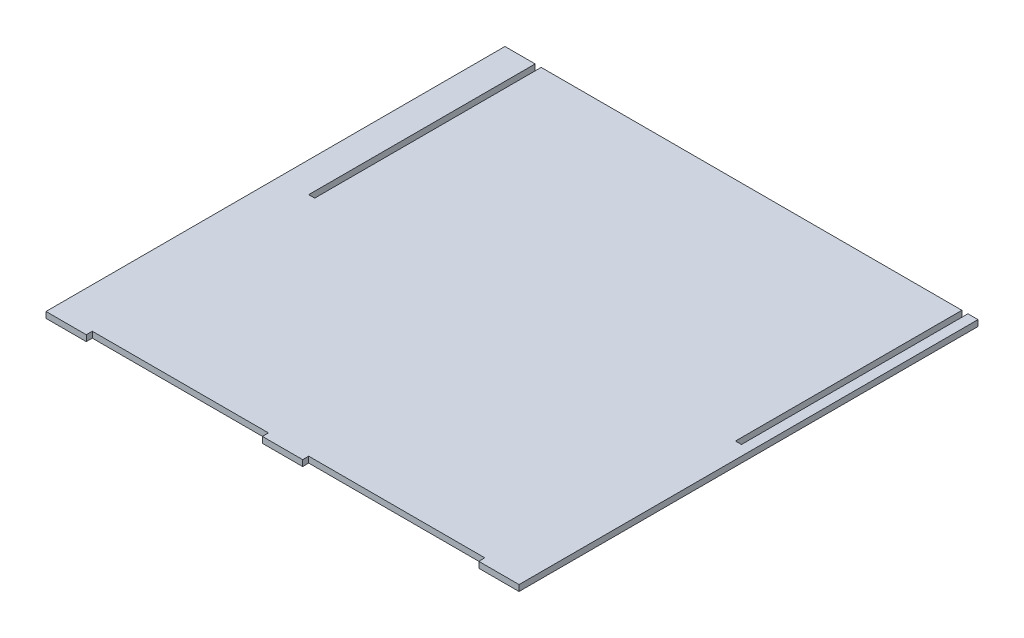
ISO-10303-21;
HEADER;
FILE_DESCRIPTION(('STEP AP214'),'2;1');
FILE_NAME('part.step','',(''),(''),'','','');
FILE_SCHEMA(('AUTOMOTIVE_DESIGN { 1 0 10303 214 1 1 1 1 }'));
ENDSEC;
DATA;
#1=APPLICATION_CONTEXT('core data for automotive mechanical design processes');
#2=APPLICATION_PROTOCOL_DEFINITION('international standard','automotive_design',2000,#1);
#3=PRODUCT_CONTEXT('',#1,'mechanical');
#4=PRODUCT('Part','Part','',(#3));
#5=PRODUCT_RELATED_PRODUCT_CATEGORY('part','',(#4));
#6=PRODUCT_DEFINITION_FORMATION('','',#4);
#7=PRODUCT_DEFINITION_CONTEXT('part definition',#1,'design');
#8=PRODUCT_DEFINITION('design','',#6,#7);
#9=PRODUCT_DEFINITION_SHAPE('','',#8);
#10=(LENGTH_UNIT() NAMED_UNIT(*) SI_UNIT(.MILLI.,.METRE.));
#11=(NAMED_UNIT(*) PLANE_ANGLE_UNIT() SI_UNIT($,.RADIAN.));
#12=(NAMED_UNIT(*) SI_UNIT($,.STERADIAN.) SOLID_ANGLE_UNIT());
#13=UNCERTAINTY_MEASURE_WITH_UNIT(LENGTH_MEASURE(1.E-05),#10,'distance_accuracy_value','');
#14=(GEOMETRIC_REPRESENTATION_CONTEXT(3) GLOBAL_UNCERTAINTY_ASSIGNED_CONTEXT((#13)) GLOBAL_UNIT_ASSIGNED_CONTEXT((#10,
#11,#12)) REPRESENTATION_CONTEXT('',''));
#15=CARTESIAN_POINT('',(0.,0.,0.));
#16=DIRECTION('',(0.,0.,1.));
#17=DIRECTION('',(1.,0.,0.));
#18=AXIS2_PLACEMENT_3D('',#15,#16,#17);
#19=CARTESIAN_POINT('',(0.,6.,-456.));
#20=DIRECTION('',(0.,0.,1.));
#21=DIRECTION('',(1.,0.,0.));
#22=AXIS2_PLACEMENT_3D('',#19,#20,#21);
#23=PLANE('',#22);
#24=DIRECTION('',(-1.,0.,0.));
#25=VECTOR('',#24,1.);
#26=CARTESIAN_POINT('',(0.,0.,-456.));
#27=LINE('',#26,#25);
#28=CARTESIAN_POINT('',(-16.,0.,-456.));
#29=VERTEX_POINT('',#28);
#30=CARTESIAN_POINT('',(-434.,0.,-456.));
#31=VERTEX_POINT('',#30);
#32=EDGE_CURVE('E200',#29,#31,#27,.T.);
#33=ORIENTED_EDGE('',*,*,#32,.T.);
#34=DIRECTION('',(0.,1.,0.));
#35=VECTOR('',#34,1.);
#36=CARTESIAN_POINT('',(-434.,0.,-456.));
#37=LINE('',#36,#35);
#38=CARTESIAN_POINT('',(-434.,6.,-456.));
#39=VERTEX_POINT('',#38);
#40=EDGE_CURVE('E183',#31,#39,#37,.T.);
#41=ORIENTED_EDGE('',*,*,#40,.T.);
#42=DIRECTION('',(-1.,0.,0.));
#43=VECTOR('',#42,1.);
#44=CARTESIAN_POINT('',(0.,6.,-456.));
#45=LINE('',#44,#43);
#46=CARTESIAN_POINT('',(-16.,6.,-456.));
#47=VERTEX_POINT('',#46);
#48=EDGE_CURVE('E391',#47,#39,#45,.T.);
#49=ORIENTED_EDGE('',*,*,#48,.F.);
#50=DIRECTION('',(0.,1.,0.));
#51=VECTOR('',#50,1.);
#52=CARTESIAN_POINT('',(-16.,0.,-456.));
#53=LINE('',#52,#51);
#54=EDGE_CURVE('E207',#29,#47,#53,.T.);
#55=ORIENTED_EDGE('',*,*,#54,.F.);
#56=EDGE_LOOP('',(#33,#41,#49,#55));
#57=FACE_BOUND('',#56,.T.);
#58=ADVANCED_FACE('F45',(#57),#23,.F.);
#59=CARTESIAN_POINT('',(0.,0.,-456.));
#60=VERTEX_POINT('',#59);
#61=CARTESIAN_POINT('',(-10.,0.,-456.));
#62=VERTEX_POINT('',#61);
#63=EDGE_CURVE('E209',#60,#62,#27,.T.);
#64=ORIENTED_EDGE('',*,*,#63,.T.);
#65=DIRECTION('',(0.,1.,0.));
#66=VECTOR('',#65,1.);
#67=CARTESIAN_POINT('',(-10.,0.,-456.));
#68=LINE('',#67,#66);
#69=CARTESIAN_POINT('',(-10.,6.,-456.));
#70=VERTEX_POINT('',#69);
#71=EDGE_CURVE('E335',#62,#70,#68,.T.);
#72=ORIENTED_EDGE('',*,*,#71,.T.);
#73=CARTESIAN_POINT('',(0.,6.,-456.));
#74=VERTEX_POINT('',#73);
#75=EDGE_CURVE('E316',#74,#70,#45,.T.);
#76=ORIENTED_EDGE('',*,*,#75,.F.);
#77=DIRECTION('',(0.,-1.,0.));
#78=VECTOR('',#77,1.);
#79=CARTESIAN_POINT('',(0.,6.,-456.));
#80=LINE('',#79,#78);
#81=EDGE_CURVE('E232',#74,#60,#80,.T.);
#82=ORIENTED_EDGE('',*,*,#81,.T.);
#83=EDGE_LOOP('',(#64,#72,#76,#82));
#84=FACE_BOUND('',#83,.T.);
#85=ADVANCED_FACE('F313',(#84),#23,.F.);
#86=CARTESIAN_POINT('',(-470.,6.,0.));
#87=DIRECTION('',(0.,0.,-1.));
#88=DIRECTION('',(-1.,0.,0.));
#89=AXIS2_PLACEMENT_3D('',#86,#87,#88);
#90=PLANE('',#89);
#91=DIRECTION('',(1.,0.,0.));
#92=VECTOR('',#91,1.);
#93=CARTESIAN_POINT('',(-470.,0.,0.));
#94=LINE('',#93,#92);
#95=CARTESIAN_POINT('',(-470.,0.,0.));
#96=VERTEX_POINT('',#95);
#97=CARTESIAN_POINT('',(-430.,0.,0.));
#98=VERTEX_POINT('',#97);
#99=EDGE_CURVE('E275',#96,#98,#94,.T.);
#100=ORIENTED_EDGE('',*,*,#99,.T.);
#101=DIRECTION('',(0.,-1.,0.));
#102=VECTOR('',#101,1.);
#103=CARTESIAN_POINT('',(-430.,6.,0.));
#104=LINE('',#103,#102);
#105=CARTESIAN_POINT('',(-430.,6.,0.));
#106=VERTEX_POINT('',#105);
#107=EDGE_CURVE('E11',#106,#98,#104,.T.);
#108=ORIENTED_EDGE('',*,*,#107,.F.);
#109=DIRECTION('',(1.,0.,0.));
#110=VECTOR('',#109,1.);
#111=CARTESIAN_POINT('',(-470.,6.,0.));
#112=LINE('',#111,#110);
#113=CARTESIAN_POINT('',(-470.,6.,0.));
#114=VERTEX_POINT('',#113);
#115=EDGE_CURVE('E223',#114,#106,#112,.T.);
#116=ORIENTED_EDGE('',*,*,#115,.F.);
#117=DIRECTION('',(0.,-1.,0.));
#118=VECTOR('',#117,1.);
#119=CARTESIAN_POINT('',(-470.,6.,0.));
#120=LINE('',#119,#118);
#121=EDGE_CURVE('E224',#114,#96,#120,.T.);
#122=ORIENTED_EDGE('',*,*,#121,.T.);
#123=EDGE_LOOP('',(#100,#108,#116,#122));
#124=FACE_BOUND('',#123,.T.);
#125=ADVANCED_FACE('F47',(#124),#90,.F.);
#126=CARTESIAN_POINT('',(-430.,6.,0.));
#127=DIRECTION('',(-1.,0.,0.));
#128=DIRECTION('',(0.,0.,1.));
#129=AXIS2_PLACEMENT_3D('',#126,#127,#128);
#130=PLANE('',#129);
#131=DIRECTION('',(0.,0.,-1.));
#132=VECTOR('',#131,1.);
#133=CARTESIAN_POINT('',(-430.,0.,0.));
#134=LINE('',#133,#132);
#135=CARTESIAN_POINT('',(-430.,0.,-6.));
#136=VERTEX_POINT('',#135);
#137=EDGE_CURVE('E269',#98,#136,#134,.T.);
#138=ORIENTED_EDGE('',*,*,#137,.T.);
#139=DIRECTION('',(0.,-1.,0.));
#140=VECTOR('',#139,1.);
#141=CARTESIAN_POINT('',(-430.,6.,-6.));
#142=LINE('',#141,#140);
#143=CARTESIAN_POINT('',(-430.,6.,-6.));
#144=VERTEX_POINT('',#143);
#145=EDGE_CURVE('E54',#144,#136,#142,.T.);
#146=ORIENTED_EDGE('',*,*,#145,.F.);
#147=DIRECTION('',(0.,0.,-1.));
#148=VECTOR('',#147,1.);
#149=CARTESIAN_POINT('',(-430.,6.,0.));
#150=LINE('',#149,#148);
#151=EDGE_CURVE('E356',#106,#144,#150,.T.);
#152=ORIENTED_EDGE('',*,*,#151,.F.);
#153=ORIENTED_EDGE('',*,*,#107,.T.);
#154=EDGE_LOOP('',(#138,#146,#152,#153));
#155=FACE_BOUND('',#154,.T.);
#156=ADVANCED_FACE('F270',(#155),#130,.F.);
#157=CARTESIAN_POINT('',(-255.,6.,-5.99999999999999));
#158=DIRECTION('',(0.,0.,1.));
#159=DIRECTION('',(1.,0.,0.));
#160=AXIS2_PLACEMENT_3D('',#157,#158,#159);
#161=PLANE('',#160);
#162=DIRECTION('',(-1.,0.,0.));
#163=VECTOR('',#162,1.);
#164=CARTESIAN_POINT('',(-255.,0.,-5.99999999999999));
#165=LINE('',#164,#163);
#166=CARTESIAN_POINT('',(-255.,0.,-5.99999999999999));
#167=VERTEX_POINT('',#166);
#168=EDGE_CURVE('E264',#167,#136,#165,.T.);
#169=ORIENTED_EDGE('',*,*,#168,.F.);
#170=DIRECTION('',(0.,-1.,0.));
#171=VECTOR('',#170,1.);
#172=CARTESIAN_POINT('',(-255.,6.,-5.99999999999999));
#173=LINE('',#172,#171);
#174=CARTESIAN_POINT('',(-255.,6.,-5.99999999999999));
#175=VERTEX_POINT('',#174);
#176=EDGE_CURVE('E254',#175,#167,#173,.T.);
#177=ORIENTED_EDGE('',*,*,#176,.F.);
#178=DIRECTION('',(-1.,0.,0.));
#179=VECTOR('',#178,1.);
#180=CARTESIAN_POINT('',(-255.,6.,-5.99999999999999));
#181=LINE('',#180,#179);
#182=EDGE_CURVE('E267',#175,#144,#181,.T.);
#183=ORIENTED_EDGE('',*,*,#182,.T.);
#184=ORIENTED_EDGE('',*,*,#145,.T.);
#185=EDGE_LOOP('',(#169,#177,#183,#184));
#186=FACE_BOUND('',#185,.T.);
#187=ADVANCED_FACE('F262',(#186),#161,.T.);
#188=CARTESIAN_POINT('',(-255.,6.,0.));
#189=DIRECTION('',(-1.,0.,0.));
#190=DIRECTION('',(0.,0.,1.));
#191=AXIS2_PLACEMENT_3D('',#188,#189,#190);
#192=PLANE('',#191);
#193=DIRECTION('',(0.,0.,-1.));
#194=VECTOR('',#193,1.);
#195=CARTESIAN_POINT('',(-255.,0.,0.));
#196=LINE('',#195,#194);
#197=CARTESIAN_POINT('',(-255.,0.,0.));
#198=VERTEX_POINT('',#197);
#199=EDGE_CURVE('E279',#198,#167,#196,.T.);
#200=ORIENTED_EDGE('',*,*,#199,.F.);
#201=DIRECTION('',(0.,-1.,0.));
#202=VECTOR('',#201,1.);
#203=CARTESIAN_POINT('',(-255.,6.,0.));
#204=LINE('',#203,#202);
#205=CARTESIAN_POINT('',(-255.,6.,0.));
#206=VERTEX_POINT('',#205);
#207=EDGE_CURVE('E251',#206,#198,#204,.T.);
#208=ORIENTED_EDGE('',*,*,#207,.F.);
#209=DIRECTION('',(0.,0.,-1.));
#210=VECTOR('',#209,1.);
#211=CARTESIAN_POINT('',(-255.,6.,0.));
#212=LINE('',#211,#210);
#213=EDGE_CURVE('E361',#206,#175,#212,.T.);
#214=ORIENTED_EDGE('',*,*,#213,.T.);
#215=ORIENTED_EDGE('',*,*,#176,.T.);
#216=EDGE_LOOP('',(#200,#208,#214,#215));
#217=FACE_BOUND('',#216,.T.);
#218=ADVANCED_FACE('F478',(#217),#192,.T.);
#219=CARTESIAN_POINT('',(-215.,6.,0.));
#220=DIRECTION('',(0.,0.,1.));
#221=DIRECTION('',(1.,0.,0.));
#222=AXIS2_PLACEMENT_3D('',#219,#220,#221);
#223=PLANE('',#222);
#224=DIRECTION('',(-1.,0.,0.));
#225=VECTOR('',#224,1.);
#226=CARTESIAN_POINT('',(-215.,0.,0.));
#227=LINE('',#226,#225);
#228=CARTESIAN_POINT('',(-215.,0.,0.));
#229=VERTEX_POINT('',#228);
#230=EDGE_CURVE('E283',#229,#198,#227,.T.);
#231=ORIENTED_EDGE('',*,*,#230,.F.);
#232=DIRECTION('',(0.,-1.,0.));
#233=VECTOR('',#232,1.);
#234=CARTESIAN_POINT('',(-215.,6.,0.));
#235=LINE('',#234,#233);
#236=CARTESIAN_POINT('',(-215.,6.,0.));
#237=VERTEX_POINT('',#236);
#238=EDGE_CURVE('E248',#237,#229,#235,.T.);
#239=ORIENTED_EDGE('',*,*,#238,.F.);
#240=DIRECTION('',(-1.,0.,0.));
#241=VECTOR('',#240,1.);
#242=CARTESIAN_POINT('',(-215.,6.,0.));
#243=LINE('',#242,#241);
#244=EDGE_CURVE('E365',#237,#206,#243,.T.);
#245=ORIENTED_EDGE('',*,*,#244,.T.);
#246=ORIENTED_EDGE('',*,*,#207,.T.);
#247=EDGE_LOOP('',(#231,#239,#245,#246));
#248=FACE_BOUND('',#247,.T.);
#249=ADVANCED_FACE('F474',(#248),#223,.T.);
#250=CARTESIAN_POINT('',(-215.,6.,-5.99999999999999));
#251=DIRECTION('',(1.,0.,0.));
#252=DIRECTION('',(0.,0.,-1.));
#253=AXIS2_PLACEMENT_3D('',#250,#251,#252);
#254=PLANE('',#253);
#255=DIRECTION('',(0.,0.,1.));
#256=VECTOR('',#255,1.);
#257=CARTESIAN_POINT('',(-215.,0.,-5.99999999999999));
#258=LINE('',#257,#256);
#259=CARTESIAN_POINT('',(-215.,0.,-5.99999999999999));
#260=VERTEX_POINT('',#259);
#261=EDGE_CURVE('E289',#260,#229,#258,.T.);
#262=ORIENTED_EDGE('',*,*,#261,.F.);
#263=DIRECTION('',(0.,-1.,0.));
#264=VECTOR('',#263,1.);
#265=CARTESIAN_POINT('',(-215.,6.,-5.99999999999999));
#266=LINE('',#265,#264);
#267=CARTESIAN_POINT('',(-215.,6.,-5.99999999999999));
#268=VERTEX_POINT('',#267);
#269=EDGE_CURVE('E245',#268,#260,#266,.T.);
#270=ORIENTED_EDGE('',*,*,#269,.F.);
#271=DIRECTION('',(0.,0.,1.));
#272=VECTOR('',#271,1.);
#273=CARTESIAN_POINT('',(-215.,6.,-5.99999999999999));
#274=LINE('',#273,#272);
#275=EDGE_CURVE('E369',#268,#237,#274,.T.);
#276=ORIENTED_EDGE('',*,*,#275,.T.);
#277=ORIENTED_EDGE('',*,*,#238,.T.);
#278=EDGE_LOOP('',(#262,#270,#276,#277));
#279=FACE_BOUND('',#278,.T.);
#280=ADVANCED_FACE('F470',(#279),#254,.T.);
#281=CARTESIAN_POINT('',(-40.,6.,-5.99999999999999));
#282=DIRECTION('',(0.,0.,1.));
#283=DIRECTION('',(1.,0.,0.));
#284=AXIS2_PLACEMENT_3D('',#281,#282,#283);
#285=PLANE('',#284);
#286=DIRECTION('',(-1.,0.,0.));
#287=VECTOR('',#286,1.);
#288=CARTESIAN_POINT('',(-40.,0.,-5.99999999999999));
#289=LINE('',#288,#287);
#290=CARTESIAN_POINT('',(-40.,0.,-5.99999999999999));
#291=VERTEX_POINT('',#290);
#292=EDGE_CURVE('E293',#291,#260,#289,.T.);
#293=ORIENTED_EDGE('',*,*,#292,.F.);
#294=DIRECTION('',(0.,-1.,0.));
#295=VECTOR('',#294,1.);
#296=CARTESIAN_POINT('',(-40.,6.,-5.99999999999999));
#297=LINE('',#296,#295);
#298=CARTESIAN_POINT('',(-40.,6.,-5.99999999999999));
#299=VERTEX_POINT('',#298);
#300=EDGE_CURVE('E242',#299,#291,#297,.T.);
#301=ORIENTED_EDGE('',*,*,#300,.F.);
#302=DIRECTION('',(-1.,0.,0.));
#303=VECTOR('',#302,1.);
#304=CARTESIAN_POINT('',(-40.,6.,-5.99999999999999));
#305=LINE('',#304,#303);
#306=EDGE_CURVE('E373',#299,#268,#305,.T.);
#307=ORIENTED_EDGE('',*,*,#306,.T.);
#308=ORIENTED_EDGE('',*,*,#269,.T.);
#309=EDGE_LOOP('',(#293,#301,#307,#308));
#310=FACE_BOUND('',#309,.T.);
#311=ADVANCED_FACE('F466',(#310),#285,.T.);
#312=CARTESIAN_POINT('',(-40.,6.,0.));
#313=DIRECTION('',(-1.,0.,0.));
#314=DIRECTION('',(0.,0.,1.));
#315=AXIS2_PLACEMENT_3D('',#312,#313,#314);
#316=PLANE('',#315);
#317=DIRECTION('',(0.,0.,-1.));
#318=VECTOR('',#317,1.);
#319=CARTESIAN_POINT('',(-40.,0.,0.));
#320=LINE('',#319,#318);
#321=CARTESIAN_POINT('',(-40.,0.,0.));
#322=VERTEX_POINT('',#321);
#323=EDGE_CURVE('E297',#322,#291,#320,.T.);
#324=ORIENTED_EDGE('',*,*,#323,.F.);
#325=DIRECTION('',(0.,-1.,0.));
#326=VECTOR('',#325,1.);
#327=CARTESIAN_POINT('',(-40.,6.,0.));
#328=LINE('',#327,#326);
#329=CARTESIAN_POINT('',(-40.,6.,0.));
#330=VERTEX_POINT('',#329);
#331=EDGE_CURVE('E239',#330,#322,#328,.T.);
#332=ORIENTED_EDGE('',*,*,#331,.F.);
#333=DIRECTION('',(0.,0.,-1.));
#334=VECTOR('',#333,1.);
#335=CARTESIAN_POINT('',(-40.,6.,0.));
#336=LINE('',#335,#334);
#337=EDGE_CURVE('E377',#330,#299,#336,.T.);
#338=ORIENTED_EDGE('',*,*,#337,.T.);
#339=ORIENTED_EDGE('',*,*,#300,.T.);
#340=EDGE_LOOP('',(#324,#332,#338,#339));
#341=FACE_BOUND('',#340,.T.);
#342=ADVANCED_FACE('F460',(#341),#316,.T.);
#343=CARTESIAN_POINT('',(0.,6.,0.));
#344=DIRECTION('',(0.,0.,1.));
#345=DIRECTION('',(1.,0.,0.));
#346=AXIS2_PLACEMENT_3D('',#343,#344,#345);
#347=PLANE('',#346);
#348=DIRECTION('',(-1.,0.,0.));
#349=VECTOR('',#348,1.);
#350=CARTESIAN_POINT('',(0.,0.,0.));
#351=LINE('',#350,#349);
#352=CARTESIAN_POINT('',(0.,0.,0.));
#353=VERTEX_POINT('',#352);
#354=EDGE_CURVE('E300',#353,#322,#351,.T.);
#355=ORIENTED_EDGE('',*,*,#354,.F.);
#356=DIRECTION('',(0.,-1.,0.));
#357=VECTOR('',#356,1.);
#358=CARTESIAN_POINT('',(0.,6.,0.));
#359=LINE('',#358,#357);
#360=CARTESIAN_POINT('',(0.,6.,0.));
#361=VERTEX_POINT('',#360);
#362=EDGE_CURVE('E236',#361,#353,#359,.T.);
#363=ORIENTED_EDGE('',*,*,#362,.F.);
#364=DIRECTION('',(-1.,0.,0.));
#365=VECTOR('',#364,1.);
#366=CARTESIAN_POINT('',(0.,6.,0.));
#367=LINE('',#366,#365);
#368=EDGE_CURVE('E381',#361,#330,#367,.T.);
#369=ORIENTED_EDGE('',*,*,#368,.T.);
#370=ORIENTED_EDGE('',*,*,#331,.T.);
#371=EDGE_LOOP('',(#355,#363,#369,#370));
#372=FACE_BOUND('',#371,.T.);
#373=ADVANCED_FACE('F456',(#372),#347,.T.);
#374=CARTESIAN_POINT('',(0.,6.,0.));
#375=DIRECTION('',(-1.,0.,0.));
#376=DIRECTION('',(0.,0.,1.));
#377=AXIS2_PLACEMENT_3D('',#374,#375,#376);
#378=PLANE('',#377);
#379=DIRECTION('',(0.,0.,-1.));
#380=VECTOR('',#379,1.);
#381=CARTESIAN_POINT('',(0.,0.,0.));
#382=LINE('',#381,#380);
#383=EDGE_CURVE('E216',#353,#60,#382,.T.);
#384=ORIENTED_EDGE('',*,*,#383,.T.);
#385=ORIENTED_EDGE('',*,*,#81,.F.);
#386=DIRECTION('',(0.,0.,-1.));
#387=VECTOR('',#386,1.);
#388=CARTESIAN_POINT('',(0.,6.,0.));
#389=LINE('',#388,#387);
#390=EDGE_CURVE('E385',#361,#74,#389,.T.);
#391=ORIENTED_EDGE('',*,*,#390,.F.);
#392=ORIENTED_EDGE('',*,*,#362,.T.);
#393=EDGE_LOOP('',(#384,#385,#391,#392));
#394=FACE_BOUND('',#393,.T.);
#395=ADVANCED_FACE('F308',(#394),#378,.F.);
#396=CARTESIAN_POINT('',(-440.,6.,-456.));
#397=VERTEX_POINT('',#396);
#398=CARTESIAN_POINT('',(-470.,6.,-456.));
#399=VERTEX_POINT('',#398);
#400=EDGE_CURVE('E388',#397,#399,#45,.T.);
#401=ORIENTED_EDGE('',*,*,#400,.F.);
#402=DIRECTION('',(0.,1.,0.));
#403=VECTOR('',#402,1.);
#404=CARTESIAN_POINT('',(-440.,0.,-456.));
#405=LINE('',#404,#403);
#406=CARTESIAN_POINT('',(-440.,0.,-456.));
#407=VERTEX_POINT('',#406);
#408=EDGE_CURVE('E194',#407,#397,#405,.T.);
#409=ORIENTED_EDGE('',*,*,#408,.F.);
#410=CARTESIAN_POINT('',(-470.,0.,-456.));
#411=VERTEX_POINT('',#410);
#412=EDGE_CURVE('E210',#407,#411,#27,.T.);
#413=ORIENTED_EDGE('',*,*,#412,.T.);
#414=DIRECTION('',(0.,-1.,0.));
#415=VECTOR('',#414,1.);
#416=CARTESIAN_POINT('',(-470.,6.,-456.));
#417=LINE('',#416,#415);
#418=EDGE_CURVE('E227',#399,#411,#417,.T.);
#419=ORIENTED_EDGE('',*,*,#418,.F.);
#420=EDGE_LOOP('',(#401,#409,#413,#419));
#421=FACE_BOUND('',#420,.T.);
#422=ADVANCED_FACE('F405',(#421),#23,.F.);
#423=CARTESIAN_POINT('',(-470.,6.,0.));
#424=DIRECTION('',(-1.,0.,0.));
#425=DIRECTION('',(0.,0.,1.));
#426=AXIS2_PLACEMENT_3D('',#423,#424,#425);
#427=PLANE('',#426);
#428=DIRECTION('',(0.,0.,-1.));
#429=VECTOR('',#428,1.);
#430=CARTESIAN_POINT('',(-470.,0.,0.));
#431=LINE('',#430,#429);
#432=EDGE_CURVE('E215',#96,#411,#431,.T.);
#433=ORIENTED_EDGE('',*,*,#432,.F.);
#434=ORIENTED_EDGE('',*,*,#121,.F.);
#435=DIRECTION('',(0.,0.,-1.));
#436=VECTOR('',#435,1.);
#437=CARTESIAN_POINT('',(-470.,6.,0.));
#438=LINE('',#437,#436);
#439=EDGE_CURVE('E228',#114,#399,#438,.T.);
#440=ORIENTED_EDGE('',*,*,#439,.T.);
#441=ORIENTED_EDGE('',*,*,#418,.T.);
#442=EDGE_LOOP('',(#433,#434,#440,#441));
#443=FACE_BOUND('',#442,.T.);
#444=ADVANCED_FACE('F400',(#443),#427,.T.);
#445=CARTESIAN_POINT('',(0.,6.,0.));
#446=DIRECTION('',(0.,1.,0.));
#447=DIRECTION('',(0.,0.,1.));
#448=AXIS2_PLACEMENT_3D('',#445,#446,#447);
#449=PLANE('',#448);
#450=DIRECTION('',(0.,0.,-1.));
#451=VECTOR('',#450,1.);
#452=CARTESIAN_POINT('',(-434.,6.,-456.));
#453=LINE('',#452,#451);
#454=CARTESIAN_POINT('',(-434.,6.,-231.));
#455=VERTEX_POINT('',#454);
#456=EDGE_CURVE('E188',#455,#39,#453,.T.);
#457=ORIENTED_EDGE('',*,*,#456,.F.);
#458=DIRECTION('',(1.,0.,0.));
#459=VECTOR('',#458,1.);
#460=CARTESIAN_POINT('',(-434.,6.,-231.));
#461=LINE('',#460,#459);
#462=CARTESIAN_POINT('',(-440.,6.,-231.));
#463=VERTEX_POINT('',#462);
#464=EDGE_CURVE('E204',#463,#455,#461,.T.);
#465=ORIENTED_EDGE('',*,*,#464,.F.);
#466=DIRECTION('',(0.,0.,1.));
#467=VECTOR('',#466,1.);
#468=CARTESIAN_POINT('',(-440.,6.,-456.));
#469=LINE('',#468,#467);
#470=EDGE_CURVE('E415',#397,#463,#469,.T.);
#471=ORIENTED_EDGE('',*,*,#470,.F.);
#472=ORIENTED_EDGE('',*,*,#400,.T.);
#473=ORIENTED_EDGE('',*,*,#439,.F.);
#474=ORIENTED_EDGE('',*,*,#115,.T.);
#475=ORIENTED_EDGE('',*,*,#151,.T.);
#476=ORIENTED_EDGE('',*,*,#182,.F.);
#477=ORIENTED_EDGE('',*,*,#213,.F.);
#478=ORIENTED_EDGE('',*,*,#244,.F.);
#479=ORIENTED_EDGE('',*,*,#275,.F.);
#480=ORIENTED_EDGE('',*,*,#306,.F.);
#481=ORIENTED_EDGE('',*,*,#337,.F.);
#482=ORIENTED_EDGE('',*,*,#368,.F.);
#483=ORIENTED_EDGE('',*,*,#390,.T.);
#484=ORIENTED_EDGE('',*,*,#75,.T.);
#485=DIRECTION('',(0.,0.,-1.));
#486=VECTOR('',#485,1.);
#487=CARTESIAN_POINT('',(-10.,6.,-456.));
#488=LINE('',#487,#486);
#489=CARTESIAN_POINT('',(-9.99999999999996,6.,-231.));
#490=VERTEX_POINT('',#489);
#491=EDGE_CURVE('E336',#490,#70,#488,.T.);
#492=ORIENTED_EDGE('',*,*,#491,.F.);
#493=DIRECTION('',(1.,0.,0.));
#494=VECTOR('',#493,1.);
#495=CARTESIAN_POINT('',(-9.99999999999996,6.,-231.));
#496=LINE('',#495,#494);
#497=CARTESIAN_POINT('',(-16.,6.,-231.));
#498=VERTEX_POINT('',#497);
#499=EDGE_CURVE('E323',#498,#490,#496,.T.);
#500=ORIENTED_EDGE('',*,*,#499,.F.);
#501=DIRECTION('',(0.,0.,1.));
#502=VECTOR('',#501,1.);
#503=CARTESIAN_POINT('',(-16.,6.,-456.));
#504=LINE('',#503,#502);
#505=EDGE_CURVE('E329',#47,#498,#504,.T.);
#506=ORIENTED_EDGE('',*,*,#505,.F.);
#507=ORIENTED_EDGE('',*,*,#48,.T.);
#508=EDGE_LOOP('',(#457,#465,#471,#472,#473,#474,#475,#476,#477,#478,#479,#480,#481,#482,#483,
#484,#492,#500,#506,#507));
#509=FACE_BOUND('',#508,.T.);
#510=ADVANCED_FACE('F431',(#509),#449,.T.);
#511=CARTESIAN_POINT('',(0.,0.,0.));
#512=DIRECTION('',(0.,1.,0.));
#513=DIRECTION('',(0.,0.,1.));
#514=AXIS2_PLACEMENT_3D('',#511,#512,#513);
#515=PLANE('',#514);
#516=DIRECTION('',(1.,0.,0.));
#517=VECTOR('',#516,1.);
#518=CARTESIAN_POINT('',(-434.,0.,-231.));
#519=LINE('',#518,#517);
#520=CARTESIAN_POINT('',(-440.,0.,-231.));
#521=VERTEX_POINT('',#520);
#522=CARTESIAN_POINT('',(-434.,0.,-231.));
#523=VERTEX_POINT('',#522);
#524=EDGE_CURVE('E61',#521,#523,#519,.T.);
#525=ORIENTED_EDGE('',*,*,#524,.T.);
#526=DIRECTION('',(0.,0.,-1.));
#527=VECTOR('',#526,1.);
#528=CARTESIAN_POINT('',(-434.,0.,-456.));
#529=LINE('',#528,#527);
#530=EDGE_CURVE('E186',#523,#31,#529,.T.);
#531=ORIENTED_EDGE('',*,*,#530,.T.);
#532=ORIENTED_EDGE('',*,*,#32,.F.);
#533=DIRECTION('',(0.,0.,1.));
#534=VECTOR('',#533,1.);
#535=CARTESIAN_POINT('',(-16.,0.,-456.));
#536=LINE('',#535,#534);
#537=CARTESIAN_POINT('',(-16.,0.,-231.));
#538=VERTEX_POINT('',#537);
#539=EDGE_CURVE('E322',#29,#538,#536,.T.);
#540=ORIENTED_EDGE('',*,*,#539,.T.);
#541=DIRECTION('',(1.,0.,0.));
#542=VECTOR('',#541,1.);
#543=CARTESIAN_POINT('',(-9.99999999999996,0.,-231.));
#544=LINE('',#543,#542);
#545=CARTESIAN_POINT('',(-9.99999999999996,0.,-231.));
#546=VERTEX_POINT('',#545);
#547=EDGE_CURVE('E69',#538,#546,#544,.T.);
#548=ORIENTED_EDGE('',*,*,#547,.T.);
#549=DIRECTION('',(0.,0.,-1.));
#550=VECTOR('',#549,1.);
#551=CARTESIAN_POINT('',(-10.,0.,-456.));
#552=LINE('',#551,#550);
#553=EDGE_CURVE('E319',#546,#62,#552,.T.);
#554=ORIENTED_EDGE('',*,*,#553,.T.);
#555=ORIENTED_EDGE('',*,*,#63,.F.);
#556=ORIENTED_EDGE('',*,*,#383,.F.);
#557=ORIENTED_EDGE('',*,*,#354,.T.);
#558=ORIENTED_EDGE('',*,*,#323,.T.);
#559=ORIENTED_EDGE('',*,*,#292,.T.);
#560=ORIENTED_EDGE('',*,*,#261,.T.);
#561=ORIENTED_EDGE('',*,*,#230,.T.);
#562=ORIENTED_EDGE('',*,*,#199,.T.);
#563=ORIENTED_EDGE('',*,*,#168,.T.);
#564=ORIENTED_EDGE('',*,*,#137,.F.);
#565=ORIENTED_EDGE('',*,*,#99,.F.);
#566=ORIENTED_EDGE('',*,*,#432,.T.);
#567=ORIENTED_EDGE('',*,*,#412,.F.);
#568=DIRECTION('',(0.,0.,1.));
#569=VECTOR('',#568,1.);
#570=CARTESIAN_POINT('',(-440.,0.,-456.));
#571=LINE('',#570,#569);
#572=EDGE_CURVE('E203',#407,#521,#571,.T.);
#573=ORIENTED_EDGE('',*,*,#572,.T.);
#574=EDGE_LOOP('',(#525,#531,#532,#540,#548,#554,#555,#556,#557,#558,#559,#560,#561,#562,#563,
#564,#565,#566,#567,#573));
#575=FACE_BOUND('',#574,.T.);
#576=ADVANCED_FACE('F198',(#575),#515,.F.);
#577=CARTESIAN_POINT('',(-10.,0.,-456.));
#578=DIRECTION('',(1.,0.,0.));
#579=DIRECTION('',(0.,0.,-1.));
#580=AXIS2_PLACEMENT_3D('',#577,#578,#579);
#581=PLANE('',#580);
#582=ORIENTED_EDGE('',*,*,#491,.T.);
#583=ORIENTED_EDGE('',*,*,#71,.F.);
#584=ORIENTED_EDGE('',*,*,#553,.F.);
#585=DIRECTION('',(0.,1.,0.));
#586=VECTOR('',#585,1.);
#587=CARTESIAN_POINT('',(-9.99999999999996,0.,-231.));
#588=LINE('',#587,#586);
#589=EDGE_CURVE('E343',#546,#490,#588,.T.);
#590=ORIENTED_EDGE('',*,*,#589,.T.);
#591=EDGE_LOOP('',(#582,#583,#584,#590));
#592=FACE_BOUND('',#591,.T.);
#593=ADVANCED_FACE('F567',(#592),#581,.F.);
#594=CARTESIAN_POINT('',(-9.99999999999996,0.,-231.));
#595=DIRECTION('',(0.,0.,1.));
#596=DIRECTION('',(1.,0.,0.));
#597=AXIS2_PLACEMENT_3D('',#594,#595,#596);
#598=PLANE('',#597);
#599=ORIENTED_EDGE('',*,*,#499,.T.);
#600=ORIENTED_EDGE('',*,*,#589,.F.);
#601=ORIENTED_EDGE('',*,*,#547,.F.);
#602=DIRECTION('',(0.,1.,0.));
#603=VECTOR('',#602,1.);
#604=CARTESIAN_POINT('',(-16.,0.,-231.));
#605=LINE('',#604,#603);
#606=EDGE_CURVE('E346',#538,#498,#605,.T.);
#607=ORIENTED_EDGE('',*,*,#606,.T.);
#608=EDGE_LOOP('',(#599,#600,#601,#607));
#609=FACE_BOUND('',#608,.T.);
#610=ADVANCED_FACE('F581',(#609),#598,.F.);
#611=CARTESIAN_POINT('',(-16.,0.,-456.));
#612=DIRECTION('',(-1.,0.,0.));
#613=DIRECTION('',(0.,0.,1.));
#614=AXIS2_PLACEMENT_3D('',#611,#612,#613);
#615=PLANE('',#614);
#616=ORIENTED_EDGE('',*,*,#505,.T.);
#617=ORIENTED_EDGE('',*,*,#606,.F.);
#618=ORIENTED_EDGE('',*,*,#539,.F.);
#619=ORIENTED_EDGE('',*,*,#54,.T.);
#620=EDGE_LOOP('',(#616,#617,#618,#619));
#621=FACE_BOUND('',#620,.T.);
#622=ADVANCED_FACE('F440',(#621),#615,.F.);
#623=CARTESIAN_POINT('',(-434.,0.,-456.));
#624=DIRECTION('',(1.,0.,0.));
#625=DIRECTION('',(0.,0.,-1.));
#626=AXIS2_PLACEMENT_3D('',#623,#624,#625);
#627=PLANE('',#626);
#628=ORIENTED_EDGE('',*,*,#456,.T.);
#629=ORIENTED_EDGE('',*,*,#40,.F.);
#630=ORIENTED_EDGE('',*,*,#530,.F.);
#631=DIRECTION('',(0.,1.,0.));
#632=VECTOR('',#631,1.);
#633=CARTESIAN_POINT('',(-434.,0.,-231.));
#634=LINE('',#633,#632);
#635=EDGE_CURVE('E339',#523,#455,#634,.T.);
#636=ORIENTED_EDGE('',*,*,#635,.T.);
#637=EDGE_LOOP('',(#628,#629,#630,#636));
#638=FACE_BOUND('',#637,.T.);
#639=ADVANCED_FACE('F185',(#638),#627,.F.);
#640=CARTESIAN_POINT('',(-434.,0.,-231.));
#641=DIRECTION('',(0.,0.,1.));
#642=DIRECTION('',(1.,0.,0.));
#643=AXIS2_PLACEMENT_3D('',#640,#641,#642);
#644=PLANE('',#643);
#645=ORIENTED_EDGE('',*,*,#464,.T.);
#646=ORIENTED_EDGE('',*,*,#635,.F.);
#647=ORIENTED_EDGE('',*,*,#524,.F.);
#648=DIRECTION('',(0.,1.,0.));
#649=VECTOR('',#648,1.);
#650=CARTESIAN_POINT('',(-440.,0.,-231.));
#651=LINE('',#650,#649);
#652=EDGE_CURVE('E424',#521,#463,#651,.T.);
#653=ORIENTED_EDGE('',*,*,#652,.T.);
#654=EDGE_LOOP('',(#645,#646,#647,#653));
#655=FACE_BOUND('',#654,.T.);
#656=ADVANCED_FACE('F432',(#655),#644,.F.);
#657=CARTESIAN_POINT('',(-440.,0.,-456.));
#658=DIRECTION('',(-1.,0.,0.));
#659=DIRECTION('',(0.,0.,1.));
#660=AXIS2_PLACEMENT_3D('',#657,#658,#659);
#661=PLANE('',#660);
#662=ORIENTED_EDGE('',*,*,#470,.T.);
#663=ORIENTED_EDGE('',*,*,#652,.F.);
#664=ORIENTED_EDGE('',*,*,#572,.F.);
#665=ORIENTED_EDGE('',*,*,#408,.T.);
#666=EDGE_LOOP('',(#662,#663,#664,#665));
#667=FACE_BOUND('',#666,.T.);
#668=ADVANCED_FACE('F428',(#667),#661,.F.);
#669=CLOSED_SHELL('',(#58,#85,#125,#156,#187,#218,#249,#280,#311,#342,#373,#395,#422,#444,#510,
#576,#593,#610,#622,#639,#656,#668));
#670=MANIFOLD_SOLID_BREP('B2',#669);
#671=ADVANCED_BREP_SHAPE_REPRESENTATION('',(#18,#670),#14);
#672=SHAPE_DEFINITION_REPRESENTATION(#9,#671);
ENDSEC;
END-ISO-10303-21;
